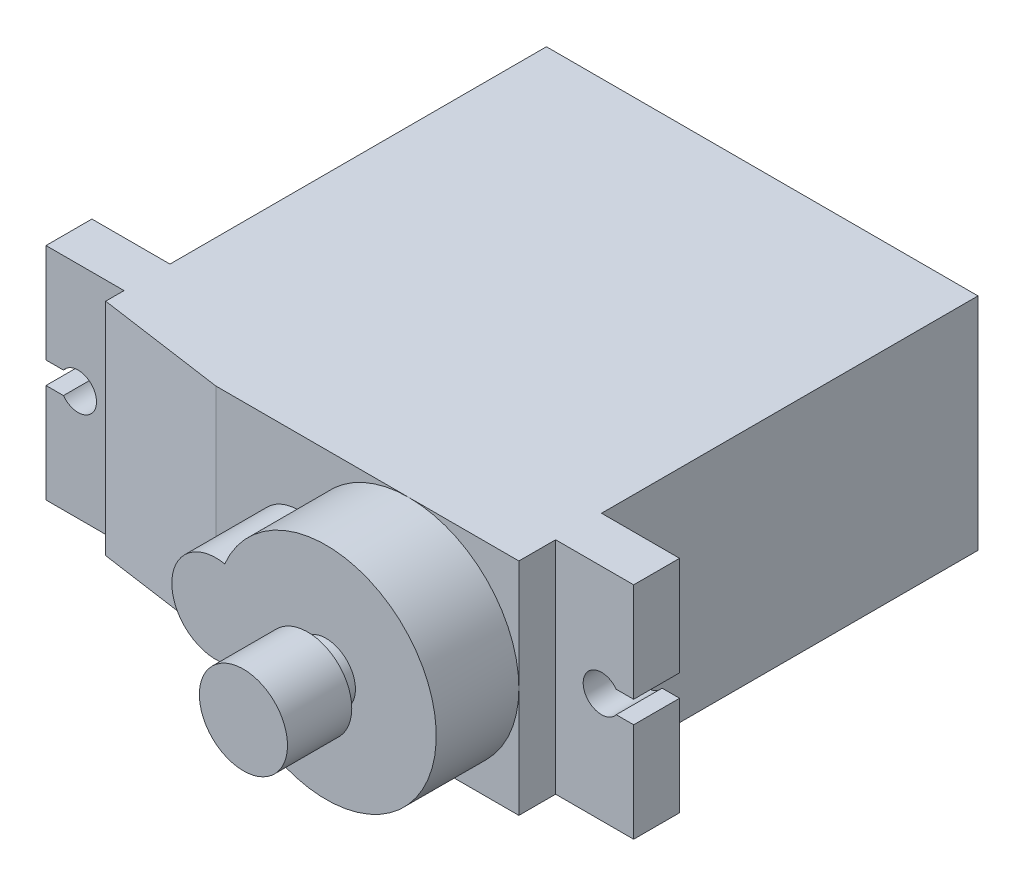
ISO-10303-21;
HEADER;
FILE_DESCRIPTION(('STEP AP214'),'2;1');
FILE_NAME('part.step','',(''),(''),'','','');
FILE_SCHEMA(('AUTOMOTIVE_DESIGN { 1 0 10303 214 1 1 1 1 }'));
ENDSEC;
DATA;
#1=APPLICATION_CONTEXT('core data for automotive mechanical design processes');
#2=APPLICATION_PROTOCOL_DEFINITION('international standard','automotive_design',2000,#1);
#3=PRODUCT_CONTEXT('',#1,'mechanical');
#4=PRODUCT('Part','Part','',(#3));
#5=PRODUCT_RELATED_PRODUCT_CATEGORY('part','',(#4));
#6=PRODUCT_DEFINITION_FORMATION('','',#4);
#7=PRODUCT_DEFINITION_CONTEXT('part definition',#1,'design');
#8=PRODUCT_DEFINITION('design','',#6,#7);
#9=PRODUCT_DEFINITION_SHAPE('','',#8);
#10=(LENGTH_UNIT() NAMED_UNIT(*) SI_UNIT(.MILLI.,.METRE.));
#11=(NAMED_UNIT(*) PLANE_ANGLE_UNIT() SI_UNIT($,.RADIAN.));
#12=(NAMED_UNIT(*) SI_UNIT($,.STERADIAN.) SOLID_ANGLE_UNIT());
#13=UNCERTAINTY_MEASURE_WITH_UNIT(LENGTH_MEASURE(1.E-05),#10,'distance_accuracy_value','');
#14=(GEOMETRIC_REPRESENTATION_CONTEXT(3) GLOBAL_UNCERTAINTY_ASSIGNED_CONTEXT((#13)) GLOBAL_UNIT_ASSIGNED_CONTEXT((#10,
#11,#12)) REPRESENTATION_CONTEXT('',''));
#15=CARTESIAN_POINT('',(0.,0.,0.));
#16=DIRECTION('',(0.,0.,1.));
#17=DIRECTION('',(1.,0.,0.));
#18=AXIS2_PLACEMENT_3D('',#15,#16,#17);
#19=CARTESIAN_POINT('',(0.,0.,6.5));
#20=DIRECTION('',(0.,0.,-1.));
#21=DIRECTION('',(-1.,0.,0.));
#22=AXIS2_PLACEMENT_3D('',#19,#20,#21);
#23=CYLINDRICAL_SURFACE('',#22,6.);
#24=DIRECTION('',(0.,0.,-1.));
#25=VECTOR('',#24,1.);
#26=CARTESIAN_POINT('',(-5.52,2.35151015307185,6.5));
#27=LINE('',#26,#25);
#28=CARTESIAN_POINT('',(-5.52,2.35151015307185,6.5));
#29=VERTEX_POINT('',#28);
#30=CARTESIAN_POINT('',(-5.52,2.35151015307185,2.));
#31=VERTEX_POINT('',#30);
#32=EDGE_CURVE('E200',#29,#31,#27,.T.);
#33=ORIENTED_EDGE('',*,*,#32,.F.);
#34=CARTESIAN_POINT('',(0.,0.,6.5));
#35=DIRECTION('',(0.,0.,1.));
#36=DIRECTION('',(1.,0.,0.));
#37=AXIS2_PLACEMENT_3D('',#34,#35,#36);
#38=CIRCLE('',#37,6.);
#39=CARTESIAN_POINT('',(-5.52,-2.35151015307185,6.5));
#40=VERTEX_POINT('',#39);
#41=EDGE_CURVE('E211',#40,#29,#38,.T.);
#42=ORIENTED_EDGE('',*,*,#41,.F.);
#43=DIRECTION('',(0.,0.,-1.));
#44=VECTOR('',#43,1.);
#45=CARTESIAN_POINT('',(-5.52,-2.35151015307185,6.5));
#46=LINE('',#45,#44);
#47=CARTESIAN_POINT('',(-5.52,-2.35151015307185,2.));
#48=VERTEX_POINT('',#47);
#49=EDGE_CURVE('E203',#40,#48,#46,.T.);
#50=ORIENTED_EDGE('',*,*,#49,.T.);
#51=CARTESIAN_POINT('',(0.,0.,2.));
#52=DIRECTION('',(0.,0.,1.));
#53=DIRECTION('',(1.,0.,0.));
#54=AXIS2_PLACEMENT_3D('',#51,#52,#53);
#55=CIRCLE('',#54,6.);
#56=CARTESIAN_POINT('',(0.,-6.,2.));
#57=VERTEX_POINT('',#56);
#58=EDGE_CURVE('E221',#48,#57,#55,.T.);
#59=ORIENTED_EDGE('',*,*,#58,.T.);
#60=CARTESIAN_POINT('',(6.,0.,2.));
#61=VERTEX_POINT('',#60);
#62=EDGE_CURVE('E217',#57,#61,#55,.T.);
#63=ORIENTED_EDGE('',*,*,#62,.T.);
#64=CARTESIAN_POINT('',(0.,6.,2.));
#65=VERTEX_POINT('',#64);
#66=EDGE_CURVE('E236',#61,#65,#55,.T.);
#67=ORIENTED_EDGE('',*,*,#66,.T.);
#68=EDGE_CURVE('E213',#65,#31,#55,.T.);
#69=ORIENTED_EDGE('',*,*,#68,.T.);
#70=EDGE_LOOP('',(#33,#42,#50,#59,#63,#67,#69));
#71=FACE_BOUND('',#70,.T.);
#72=ADVANCED_FACE('F36',(#71),#23,.T.);
#73=CARTESIAN_POINT('',(-20.,0.,-2.5));
#74=DIRECTION('',(0.,0.,1.));
#75=DIRECTION('',(1.,0.,0.));
#76=AXIS2_PLACEMENT_3D('',#73,#74,#75);
#77=PLANE('',#76);
#78=DIRECTION('',(0.,-1.,0.));
#79=VECTOR('',#78,1.);
#80=CARTESIAN_POINT('',(6.,6.,-2.5));
#81=LINE('',#80,#79);
#82=CARTESIAN_POINT('',(6.,6.,-2.5));
#83=VERTEX_POINT('',#82);
#84=CARTESIAN_POINT('',(6.,-6.,-2.5));
#85=VERTEX_POINT('',#84);
#86=EDGE_CURVE('E250',#83,#85,#81,.T.);
#87=ORIENTED_EDGE('',*,*,#86,.F.);
#88=DIRECTION('',(-1.,0.,0.));
#89=VECTOR('',#88,1.);
#90=CARTESIAN_POINT('',(10.25,6.,-2.5));
#91=LINE('',#90,#89);
#92=CARTESIAN_POINT('',(10.25,6.,-2.5));
#93=VERTEX_POINT('',#92);
#94=EDGE_CURVE('E309',#93,#83,#91,.T.);
#95=ORIENTED_EDGE('',*,*,#94,.F.);
#96=DIRECTION('',(0.,1.,0.));
#97=VECTOR('',#96,1.);
#98=CARTESIAN_POINT('',(10.25,6.,-2.5));
#99=LINE('',#98,#97);
#100=CARTESIAN_POINT('',(10.25,0.600000000000015,-2.5));
#101=VERTEX_POINT('',#100);
#102=EDGE_CURVE('E305',#101,#93,#99,.T.);
#103=ORIENTED_EDGE('',*,*,#102,.F.);
#104=DIRECTION('',(1.,0.,0.));
#105=VECTOR('',#104,1.);
#106=CARTESIAN_POINT('',(10.25,0.600000000000015,-2.5));
#107=LINE('',#106,#105);
#108=CARTESIAN_POINT('',(9.3,0.6,-2.5));
#109=VERTEX_POINT('',#108);
#110=EDGE_CURVE('E302',#109,#101,#107,.T.);
#111=ORIENTED_EDGE('',*,*,#110,.F.);
#112=CARTESIAN_POINT('',(8.5,0.,-2.5));
#113=DIRECTION('',(0.,0.,-1.));
#114=DIRECTION('',(-1.,0.,0.));
#115=AXIS2_PLACEMENT_3D('',#112,#113,#114);
#116=CIRCLE('',#115,1.);
#117=CARTESIAN_POINT('',(9.3,-0.600000000000002,-2.5));
#118=VERTEX_POINT('',#117);
#119=EDGE_CURVE('E299',#118,#109,#116,.T.);
#120=ORIENTED_EDGE('',*,*,#119,.F.);
#121=DIRECTION('',(-1.,0.,0.));
#122=VECTOR('',#121,1.);
#123=CARTESIAN_POINT('',(10.25,-0.600000000000019,-2.5));
#124=LINE('',#123,#122);
#125=CARTESIAN_POINT('',(10.25,-0.600000000000019,-2.5));
#126=VERTEX_POINT('',#125);
#127=EDGE_CURVE('E296',#126,#118,#124,.T.);
#128=ORIENTED_EDGE('',*,*,#127,.F.);
#129=DIRECTION('',(0.,1.,0.));
#130=VECTOR('',#129,1.);
#131=CARTESIAN_POINT('',(10.25,-0.600000000000019,-2.5));
#132=LINE('',#131,#130);
#133=CARTESIAN_POINT('',(10.25,-6.,-2.5));
#134=VERTEX_POINT('',#133);
#135=EDGE_CURVE('E293',#134,#126,#132,.T.);
#136=ORIENTED_EDGE('',*,*,#135,.F.);
#137=DIRECTION('',(1.,0.,0.));
#138=VECTOR('',#137,1.);
#139=CARTESIAN_POINT('',(-21.75,-6.,-2.5));
#140=LINE('',#139,#138);
#141=EDGE_CURVE('E289',#85,#134,#140,.T.);
#142=ORIENTED_EDGE('',*,*,#141,.F.);
#143=EDGE_LOOP('',(#87,#95,#103,#111,#120,#128,#136,#142));
#144=FACE_BOUND('',#143,.T.);
#145=ADVANCED_FACE('F498',(#144),#77,.F.);
#146=DIRECTION('',(0.,1.,0.));
#147=VECTOR('',#146,1.);
#148=CARTESIAN_POINT('',(-17.5,-6.,-2.5));
#149=LINE('',#148,#147);
#150=CARTESIAN_POINT('',(-17.5,-6.,-2.5));
#151=VERTEX_POINT('',#150);
#152=CARTESIAN_POINT('',(-17.5,6.,-2.5));
#153=VERTEX_POINT('',#152);
#154=EDGE_CURVE('E214',#151,#153,#149,.T.);
#155=ORIENTED_EDGE('',*,*,#154,.F.);
#156=CARTESIAN_POINT('',(-21.75,-6.,-2.5));
#157=VERTEX_POINT('',#156);
#158=EDGE_CURVE('E290',#157,#151,#140,.T.);
#159=ORIENTED_EDGE('',*,*,#158,.F.);
#160=DIRECTION('',(0.,-1.,0.));
#161=VECTOR('',#160,1.);
#162=CARTESIAN_POINT('',(-21.75,-0.600000000000015,-2.5));
#163=LINE('',#162,#161);
#164=CARTESIAN_POINT('',(-21.75,-0.600000000000015,-2.5));
#165=VERTEX_POINT('',#164);
#166=EDGE_CURVE('E286',#165,#157,#163,.T.);
#167=ORIENTED_EDGE('',*,*,#166,.F.);
#168=DIRECTION('',(-1.,0.,0.));
#169=VECTOR('',#168,1.);
#170=CARTESIAN_POINT('',(-21.75,-0.600000000000015,-2.5));
#171=LINE('',#170,#169);
#172=CARTESIAN_POINT('',(-20.8,-0.600000000000015,-2.5));
#173=VERTEX_POINT('',#172);
#174=EDGE_CURVE('E283',#173,#165,#171,.T.);
#175=ORIENTED_EDGE('',*,*,#174,.F.);
#176=CARTESIAN_POINT('',(-20.,0.,-2.5));
#177=DIRECTION('',(0.,0.,-1.));
#178=DIRECTION('',(1.,0.,0.));
#179=AXIS2_PLACEMENT_3D('',#176,#177,#178);
#180=CIRCLE('',#179,1.);
#181=CARTESIAN_POINT('',(-20.8,0.60000000000001,-2.5));
#182=VERTEX_POINT('',#181);
#183=EDGE_CURVE('E280',#182,#173,#180,.T.);
#184=ORIENTED_EDGE('',*,*,#183,.F.);
#185=DIRECTION('',(1.,0.,0.));
#186=VECTOR('',#185,1.);
#187=CARTESIAN_POINT('',(-21.75,0.600000000000011,-2.5));
#188=LINE('',#187,#186);
#189=CARTESIAN_POINT('',(-21.75,0.600000000000011,-2.5));
#190=VERTEX_POINT('',#189);
#191=EDGE_CURVE('E276',#190,#182,#188,.T.);
#192=ORIENTED_EDGE('',*,*,#191,.F.);
#193=DIRECTION('',(0.,-1.,0.));
#194=VECTOR('',#193,1.);
#195=CARTESIAN_POINT('',(-21.75,6.,-2.5));
#196=LINE('',#195,#194);
#197=CARTESIAN_POINT('',(-21.75,6.,-2.5));
#198=VERTEX_POINT('',#197);
#199=EDGE_CURVE('E273',#198,#190,#196,.T.);
#200=ORIENTED_EDGE('',*,*,#199,.F.);
#201=EDGE_CURVE('E308',#153,#198,#91,.T.);
#202=ORIENTED_EDGE('',*,*,#201,.F.);
#203=EDGE_LOOP('',(#155,#159,#167,#175,#184,#192,#200,#202));
#204=FACE_BOUND('',#203,.T.);
#205=ADVANCED_FACE('F449',(#204),#77,.F.);
#206=CARTESIAN_POINT('',(0.,0.,6.5));
#207=DIRECTION('',(0.,0.,1.));
#208=DIRECTION('',(1.,0.,0.));
#209=AXIS2_PLACEMENT_3D('',#206,#207,#208);
#210=PLANE('',#209);
#211=CARTESIAN_POINT('',(0.,0.,6.5));
#212=DIRECTION('',(0.,0.,1.));
#213=DIRECTION('',(1.,0.,0.));
#214=AXIS2_PLACEMENT_3D('',#211,#212,#213);
#215=CIRCLE('',#214,1.6);
#216=CARTESIAN_POINT('',(1.6,0.,6.5));
#217=VERTEX_POINT('',#216);
#218=EDGE_CURVE('E231',#217,#217,#215,.T.);
#219=ORIENTED_EDGE('',*,*,#218,.F.);
#220=EDGE_LOOP('',(#219));
#221=FACE_BOUND('',#220,.T.);
#222=ORIENTED_EDGE('',*,*,#41,.T.);
#223=CARTESIAN_POINT('',(-6.,0.,6.5));
#224=DIRECTION('',(0.,0.,1.));
#225=DIRECTION('',(1.,0.,0.));
#226=AXIS2_PLACEMENT_3D('',#223,#224,#225);
#227=CIRCLE('',#226,2.4);
#228=EDGE_CURVE('E197',#29,#40,#227,.T.);
#229=ORIENTED_EDGE('',*,*,#228,.T.);
#230=EDGE_LOOP('',(#222,#229));
#231=FACE_BOUND('',#230,.T.);
#232=ADVANCED_FACE('F216',(#221,#231),#210,.T.);
#233=CARTESIAN_POINT('',(0.,0.,2.));
#234=DIRECTION('',(0.,0.,1.));
#235=DIRECTION('',(1.,0.,0.));
#236=AXIS2_PLACEMENT_3D('',#233,#234,#235);
#237=PLANE('',#236);
#238=ORIENTED_EDGE('',*,*,#66,.F.);
#239=DIRECTION('',(0.,1.,0.));
#240=VECTOR('',#239,1.);
#241=CARTESIAN_POINT('',(6.,-6.,2.));
#242=LINE('',#241,#240);
#243=CARTESIAN_POINT('',(6.,6.,2.));
#244=VERTEX_POINT('',#243);
#245=EDGE_CURVE('E376',#61,#244,#242,.T.);
#246=ORIENTED_EDGE('',*,*,#245,.T.);
#247=DIRECTION('',(-1.,0.,0.));
#248=VECTOR('',#247,1.);
#249=CARTESIAN_POINT('',(6.,6.,2.));
#250=LINE('',#249,#248);
#251=EDGE_CURVE('E381',#244,#65,#250,.T.);
#252=ORIENTED_EDGE('',*,*,#251,.T.);
#253=EDGE_LOOP('',(#238,#246,#252));
#254=FACE_BOUND('',#253,.T.);
#255=ADVANCED_FACE('F486',(#254),#237,.T.);
#256=CARTESIAN_POINT('',(-10.4999999999998,6.,2.));
#257=VERTEX_POINT('',#256);
#258=EDGE_CURVE('E380',#65,#257,#250,.T.);
#259=ORIENTED_EDGE('',*,*,#258,.T.);
#260=DIRECTION('',(0.,-1.,0.));
#261=VECTOR('',#260,1.);
#262=CARTESIAN_POINT('',(-10.4999999999998,-6.,2.));
#263=LINE('',#262,#261);
#264=CARTESIAN_POINT('',(-10.4999999999998,-6.,2.));
#265=VERTEX_POINT('',#264);
#266=EDGE_CURVE('E228',#257,#265,#263,.T.);
#267=ORIENTED_EDGE('',*,*,#266,.T.);
#268=DIRECTION('',(1.,0.,0.));
#269=VECTOR('',#268,1.);
#270=CARTESIAN_POINT('',(6.,-6.,2.));
#271=LINE('',#270,#269);
#272=EDGE_CURVE('E374',#265,#57,#271,.T.);
#273=ORIENTED_EDGE('',*,*,#272,.T.);
#274=ORIENTED_EDGE('',*,*,#58,.F.);
#275=CARTESIAN_POINT('',(-6.,0.,2.));
#276=DIRECTION('',(0.,0.,1.));
#277=DIRECTION('',(1.,0.,0.));
#278=AXIS2_PLACEMENT_3D('',#275,#276,#277);
#279=CIRCLE('',#278,2.4);
#280=EDGE_CURVE('E207',#31,#48,#279,.T.);
#281=ORIENTED_EDGE('',*,*,#280,.F.);
#282=ORIENTED_EDGE('',*,*,#68,.F.);
#283=EDGE_LOOP('',(#259,#267,#273,#274,#281,#282));
#284=FACE_BOUND('',#283,.T.);
#285=ADVANCED_FACE('F478',(#284),#237,.T.);
#286=CARTESIAN_POINT('',(6.,-6.,2.));
#287=DIRECTION('',(0.,1.,0.));
#288=DIRECTION('',(-1.,0.,0.));
#289=AXIS2_PLACEMENT_3D('',#286,#287,#288);
#290=PLANE('',#289);
#291=ORIENTED_EDGE('',*,*,#272,.F.);
#292=DIRECTION('',(-0.989949493661167,0.,-0.141421356237306));
#293=VECTOR('',#292,1.);
#294=CARTESIAN_POINT('',(-10.4999999999998,-6.,2.));
#295=LINE('',#294,#293);
#296=CARTESIAN_POINT('',(-17.5,-6.,0.999999999999999));
#297=VERTEX_POINT('',#296);
#298=EDGE_CURVE('E58',#265,#297,#295,.T.);
#299=ORIENTED_EDGE('',*,*,#298,.T.);
#300=DIRECTION('',(0.,0.,-1.));
#301=VECTOR('',#300,1.);
#302=CARTESIAN_POINT('',(-17.5,-6.,2.));
#303=LINE('',#302,#301);
#304=CARTESIAN_POINT('',(-17.5,-6.,0.));
#305=VERTEX_POINT('',#304);
#306=EDGE_CURVE('E384',#297,#305,#303,.T.);
#307=ORIENTED_EDGE('',*,*,#306,.T.);
#308=DIRECTION('',(1.,0.,0.));
#309=VECTOR('',#308,1.);
#310=CARTESIAN_POINT('',(-21.75,-6.,0.));
#311=LINE('',#310,#309);
#312=CARTESIAN_POINT('',(-21.75,-6.,0.));
#313=VERTEX_POINT('',#312);
#314=EDGE_CURVE('E328',#313,#305,#311,.T.);
#315=ORIENTED_EDGE('',*,*,#314,.F.);
#316=DIRECTION('',(0.,0.,1.));
#317=VECTOR('',#316,1.);
#318=CARTESIAN_POINT('',(-21.75,-6.,-2.5));
#319=LINE('',#318,#317);
#320=EDGE_CURVE('E365',#157,#313,#319,.T.);
#321=ORIENTED_EDGE('',*,*,#320,.F.);
#322=ORIENTED_EDGE('',*,*,#158,.T.);
#323=DIRECTION('',(0.,0.,1.));
#324=VECTOR('',#323,1.);
#325=CARTESIAN_POINT('',(-17.5,-6.,-23.));
#326=LINE('',#325,#324);
#327=CARTESIAN_POINT('',(-17.5,-6.,-23.));
#328=VERTEX_POINT('',#327);
#329=EDGE_CURVE('E269',#328,#151,#326,.T.);
#330=ORIENTED_EDGE('',*,*,#329,.F.);
#331=DIRECTION('',(-1.,0.,0.));
#332=VECTOR('',#331,1.);
#333=CARTESIAN_POINT('',(6.,-6.,-23.));
#334=LINE('',#333,#332);
#335=CARTESIAN_POINT('',(6.,-6.,-23.));
#336=VERTEX_POINT('',#335);
#337=EDGE_CURVE('E246',#336,#328,#334,.T.);
#338=ORIENTED_EDGE('',*,*,#337,.F.);
#339=DIRECTION('',(0.,0.,1.));
#340=VECTOR('',#339,1.);
#341=CARTESIAN_POINT('',(6.,-6.,-23.));
#342=LINE('',#341,#340);
#343=EDGE_CURVE('E256',#336,#85,#342,.T.);
#344=ORIENTED_EDGE('',*,*,#343,.T.);
#345=ORIENTED_EDGE('',*,*,#141,.T.);
#346=DIRECTION('',(0.,0.,1.));
#347=VECTOR('',#346,1.);
#348=CARTESIAN_POINT('',(10.25,-6.,-2.5));
#349=LINE('',#348,#347);
#350=CARTESIAN_POINT('',(10.25,-6.,0.));
#351=VERTEX_POINT('',#350);
#352=EDGE_CURVE('E362',#134,#351,#349,.T.);
#353=ORIENTED_EDGE('',*,*,#352,.T.);
#354=CARTESIAN_POINT('',(6.,-6.,0.));
#355=VERTEX_POINT('',#354);
#356=EDGE_CURVE('E327',#355,#351,#311,.T.);
#357=ORIENTED_EDGE('',*,*,#356,.F.);
#358=DIRECTION('',(0.,0.,-1.));
#359=VECTOR('',#358,1.);
#360=CARTESIAN_POINT('',(6.,-6.,2.));
#361=LINE('',#360,#359);
#362=CARTESIAN_POINT('',(6.,-6.,2.));
#363=VERTEX_POINT('',#362);
#364=EDGE_CURVE('E218',#363,#355,#361,.T.);
#365=ORIENTED_EDGE('',*,*,#364,.F.);
#366=EDGE_CURVE('E377',#57,#363,#271,.T.);
#367=ORIENTED_EDGE('',*,*,#366,.F.);
#368=EDGE_LOOP('',(#291,#299,#307,#315,#321,#322,#330,#338,#344,#345,#353,#357,#365,#367));
#369=FACE_BOUND('',#368,.T.);
#370=ADVANCED_FACE('F408',(#369),#290,.F.);
#371=CARTESIAN_POINT('',(6.,-6.,2.));
#372=DIRECTION('',(-1.,0.,0.));
#373=DIRECTION('',(0.,0.,1.));
#374=AXIS2_PLACEMENT_3D('',#371,#372,#373);
#375=PLANE('',#374);
#376=ORIENTED_EDGE('',*,*,#245,.F.);
#377=EDGE_CURVE('E378',#363,#61,#242,.T.);
#378=ORIENTED_EDGE('',*,*,#377,.F.);
#379=ORIENTED_EDGE('',*,*,#364,.T.);
#380=DIRECTION('',(0.,1.,0.));
#381=VECTOR('',#380,1.);
#382=CARTESIAN_POINT('',(6.,-6.,0.));
#383=LINE('',#382,#381);
#384=CARTESIAN_POINT('',(6.,6.,0.));
#385=VERTEX_POINT('',#384);
#386=EDGE_CURVE('E351',#355,#385,#383,.T.);
#387=ORIENTED_EDGE('',*,*,#386,.T.);
#388=DIRECTION('',(0.,0.,-1.));
#389=VECTOR('',#388,1.);
#390=CARTESIAN_POINT('',(6.,6.,2.));
#391=LINE('',#390,#389);
#392=EDGE_CURVE('E224',#244,#385,#391,.T.);
#393=ORIENTED_EDGE('',*,*,#392,.F.);
#394=EDGE_LOOP('',(#376,#378,#379,#387,#393));
#395=FACE_BOUND('',#394,.T.);
#396=ADVANCED_FACE('F401',(#395),#375,.F.);
#397=CARTESIAN_POINT('',(6.,6.,2.));
#398=DIRECTION('',(0.,-1.,0.));
#399=DIRECTION('',(1.,0.,0.));
#400=AXIS2_PLACEMENT_3D('',#397,#398,#399);
#401=PLANE('',#400);
#402=DIRECTION('',(0.,0.,-1.));
#403=VECTOR('',#402,1.);
#404=CARTESIAN_POINT('',(-17.5,6.,2.));
#405=LINE('',#404,#403);
#406=CARTESIAN_POINT('',(-17.5,6.,0.999999999999999));
#407=VERTEX_POINT('',#406);
#408=CARTESIAN_POINT('',(-17.5,6.,0.));
#409=VERTEX_POINT('',#408);
#410=EDGE_CURVE('E391',#407,#409,#405,.T.);
#411=ORIENTED_EDGE('',*,*,#410,.F.);
#412=DIRECTION('',(0.989949493661167,0.,0.141421356237306));
#413=VECTOR('',#412,1.);
#414=CARTESIAN_POINT('',(-10.4999999999998,6.,2.));
#415=LINE('',#414,#413);
#416=EDGE_CURVE('E11',#407,#257,#415,.T.);
#417=ORIENTED_EDGE('',*,*,#416,.T.);
#418=ORIENTED_EDGE('',*,*,#258,.F.);
#419=ORIENTED_EDGE('',*,*,#251,.F.);
#420=ORIENTED_EDGE('',*,*,#392,.T.);
#421=DIRECTION('',(-1.,0.,0.));
#422=VECTOR('',#421,1.);
#423=CARTESIAN_POINT('',(10.25,6.,0.));
#424=LINE('',#423,#422);
#425=CARTESIAN_POINT('',(10.25,6.,0.));
#426=VERTEX_POINT('',#425);
#427=EDGE_CURVE('E277',#426,#385,#424,.T.);
#428=ORIENTED_EDGE('',*,*,#427,.F.);
#429=DIRECTION('',(0.,0.,1.));
#430=VECTOR('',#429,1.);
#431=CARTESIAN_POINT('',(10.25,6.,-2.5));
#432=LINE('',#431,#430);
#433=EDGE_CURVE('E352',#93,#426,#432,.T.);
#434=ORIENTED_EDGE('',*,*,#433,.F.);
#435=ORIENTED_EDGE('',*,*,#94,.T.);
#436=DIRECTION('',(0.,0.,1.));
#437=VECTOR('',#436,1.);
#438=CARTESIAN_POINT('',(6.,6.,-23.));
#439=LINE('',#438,#437);
#440=CARTESIAN_POINT('',(6.,6.,-23.));
#441=VERTEX_POINT('',#440);
#442=EDGE_CURVE('E263',#441,#83,#439,.T.);
#443=ORIENTED_EDGE('',*,*,#442,.F.);
#444=DIRECTION('',(1.,0.,0.));
#445=VECTOR('',#444,1.);
#446=CARTESIAN_POINT('',(-17.5,6.,-23.));
#447=LINE('',#446,#445);
#448=CARTESIAN_POINT('',(-17.5,6.,-23.));
#449=VERTEX_POINT('',#448);
#450=EDGE_CURVE('E252',#449,#441,#447,.T.);
#451=ORIENTED_EDGE('',*,*,#450,.F.);
#452=DIRECTION('',(0.,0.,1.));
#453=VECTOR('',#452,1.);
#454=CARTESIAN_POINT('',(-17.5,6.,-23.));
#455=LINE('',#454,#453);
#456=EDGE_CURVE('E266',#449,#153,#455,.T.);
#457=ORIENTED_EDGE('',*,*,#456,.T.);
#458=ORIENTED_EDGE('',*,*,#201,.T.);
#459=DIRECTION('',(0.,0.,1.));
#460=VECTOR('',#459,1.);
#461=CARTESIAN_POINT('',(-21.75,6.,-2.5));
#462=LINE('',#461,#460);
#463=CARTESIAN_POINT('',(-21.75,6.,0.));
#464=VERTEX_POINT('',#463);
#465=EDGE_CURVE('E348',#198,#464,#462,.T.);
#466=ORIENTED_EDGE('',*,*,#465,.T.);
#467=EDGE_CURVE('E346',#409,#464,#424,.T.);
#468=ORIENTED_EDGE('',*,*,#467,.F.);
#469=EDGE_LOOP('',(#411,#417,#418,#419,#420,#428,#434,#435,#443,#451,#457,#458,#466,#468));
#470=FACE_BOUND('',#469,.T.);
#471=ADVANCED_FACE('F397',(#470),#401,.F.);
#472=CARTESIAN_POINT('',(-17.5,6.,2.));
#473=DIRECTION('',(1.,0.,0.));
#474=DIRECTION('',(0.,0.,-1.));
#475=AXIS2_PLACEMENT_3D('',#472,#473,#474);
#476=PLANE('',#475);
#477=ORIENTED_EDGE('',*,*,#306,.F.);
#478=DIRECTION('',(0.,1.,0.));
#479=VECTOR('',#478,1.);
#480=CARTESIAN_POINT('',(-17.5,6.,0.999999999999999));
#481=LINE('',#480,#479);
#482=EDGE_CURVE('E44',#297,#407,#481,.T.);
#483=ORIENTED_EDGE('',*,*,#482,.T.);
#484=ORIENTED_EDGE('',*,*,#410,.T.);
#485=DIRECTION('',(0.,-1.,0.));
#486=VECTOR('',#485,1.);
#487=CARTESIAN_POINT('',(-17.5,6.,0.));
#488=LINE('',#487,#486);
#489=EDGE_CURVE('E387',#409,#305,#488,.T.);
#490=ORIENTED_EDGE('',*,*,#489,.T.);
#491=EDGE_LOOP('',(#477,#483,#484,#490));
#492=FACE_BOUND('',#491,.T.);
#493=ADVANCED_FACE('F476',(#492),#476,.F.);
#494=ORIENTED_EDGE('',*,*,#62,.F.);
#495=ORIENTED_EDGE('',*,*,#366,.T.);
#496=ORIENTED_EDGE('',*,*,#377,.T.);
#497=EDGE_LOOP('',(#494,#495,#496));
#498=FACE_BOUND('',#497,.T.);
#499=ADVANCED_FACE('F483',(#498),#237,.T.);
#500=CARTESIAN_POINT('',(-20.,0.,0.));
#501=DIRECTION('',(0.,0.,1.));
#502=DIRECTION('',(1.,0.,0.));
#503=AXIS2_PLACEMENT_3D('',#500,#501,#502);
#504=PLANE('',#503);
#505=ORIENTED_EDGE('',*,*,#386,.F.);
#506=ORIENTED_EDGE('',*,*,#356,.T.);
#507=DIRECTION('',(0.,1.,0.));
#508=VECTOR('',#507,1.);
#509=CARTESIAN_POINT('',(10.25,-0.600000000000019,0.));
#510=LINE('',#509,#508);
#511=CARTESIAN_POINT('',(10.25,-0.600000000000019,0.));
#512=VERTEX_POINT('',#511);
#513=EDGE_CURVE('E331',#351,#512,#510,.T.);
#514=ORIENTED_EDGE('',*,*,#513,.T.);
#515=DIRECTION('',(-1.,0.,0.));
#516=VECTOR('',#515,1.);
#517=CARTESIAN_POINT('',(10.25,-0.600000000000019,0.));
#518=LINE('',#517,#516);
#519=CARTESIAN_POINT('',(9.3,-0.600000000000002,0.));
#520=VERTEX_POINT('',#519);
#521=EDGE_CURVE('E334',#512,#520,#518,.T.);
#522=ORIENTED_EDGE('',*,*,#521,.T.);
#523=CARTESIAN_POINT('',(8.5,0.,0.));
#524=DIRECTION('',(0.,0.,-1.));
#525=DIRECTION('',(-1.,0.,0.));
#526=AXIS2_PLACEMENT_3D('',#523,#524,#525);
#527=CIRCLE('',#526,1.);
#528=CARTESIAN_POINT('',(9.3,0.6,0.));
#529=VERTEX_POINT('',#528);
#530=EDGE_CURVE('E337',#520,#529,#527,.T.);
#531=ORIENTED_EDGE('',*,*,#530,.T.);
#532=DIRECTION('',(1.,0.,0.));
#533=VECTOR('',#532,1.);
#534=CARTESIAN_POINT('',(10.25,0.600000000000015,0.));
#535=LINE('',#534,#533);
#536=CARTESIAN_POINT('',(10.25,0.600000000000015,0.));
#537=VERTEX_POINT('',#536);
#538=EDGE_CURVE('E340',#529,#537,#535,.T.);
#539=ORIENTED_EDGE('',*,*,#538,.T.);
#540=DIRECTION('',(0.,1.,0.));
#541=VECTOR('',#540,1.);
#542=CARTESIAN_POINT('',(10.25,6.,0.));
#543=LINE('',#542,#541);
#544=EDGE_CURVE('E343',#537,#426,#543,.T.);
#545=ORIENTED_EDGE('',*,*,#544,.T.);
#546=ORIENTED_EDGE('',*,*,#427,.T.);
#547=EDGE_LOOP('',(#505,#506,#514,#522,#531,#539,#545,#546));
#548=FACE_BOUND('',#547,.T.);
#549=ADVANCED_FACE('F407',(#548),#504,.T.);
#550=ORIENTED_EDGE('',*,*,#489,.F.);
#551=ORIENTED_EDGE('',*,*,#467,.T.);
#552=DIRECTION('',(0.,-1.,0.));
#553=VECTOR('',#552,1.);
#554=CARTESIAN_POINT('',(-21.75,6.,0.));
#555=LINE('',#554,#553);
#556=CARTESIAN_POINT('',(-21.75,0.600000000000011,0.));
#557=VERTEX_POINT('',#556);
#558=EDGE_CURVE('E272',#464,#557,#555,.T.);
#559=ORIENTED_EDGE('',*,*,#558,.T.);
#560=DIRECTION('',(1.,0.,0.));
#561=VECTOR('',#560,1.);
#562=CARTESIAN_POINT('',(-21.75,0.600000000000011,0.));
#563=LINE('',#562,#561);
#564=CARTESIAN_POINT('',(-20.8,0.60000000000001,0.));
#565=VERTEX_POINT('',#564);
#566=EDGE_CURVE('E315',#557,#565,#563,.T.);
#567=ORIENTED_EDGE('',*,*,#566,.T.);
#568=CARTESIAN_POINT('',(-20.,0.,0.));
#569=DIRECTION('',(0.,0.,-1.));
#570=DIRECTION('',(1.,0.,0.));
#571=AXIS2_PLACEMENT_3D('',#568,#569,#570);
#572=CIRCLE('',#571,1.);
#573=CARTESIAN_POINT('',(-20.8,-0.600000000000015,0.));
#574=VERTEX_POINT('',#573);
#575=EDGE_CURVE('E318',#565,#574,#572,.T.);
#576=ORIENTED_EDGE('',*,*,#575,.T.);
#577=DIRECTION('',(-1.,0.,0.));
#578=VECTOR('',#577,1.);
#579=CARTESIAN_POINT('',(-21.75,-0.600000000000015,0.));
#580=LINE('',#579,#578);
#581=CARTESIAN_POINT('',(-21.75,-0.600000000000015,0.));
#582=VERTEX_POINT('',#581);
#583=EDGE_CURVE('E321',#574,#582,#580,.T.);
#584=ORIENTED_EDGE('',*,*,#583,.T.);
#585=DIRECTION('',(0.,-1.,0.));
#586=VECTOR('',#585,1.);
#587=CARTESIAN_POINT('',(-21.75,-0.600000000000015,0.));
#588=LINE('',#587,#586);
#589=EDGE_CURVE('E324',#582,#313,#588,.T.);
#590=ORIENTED_EDGE('',*,*,#589,.T.);
#591=ORIENTED_EDGE('',*,*,#314,.T.);
#592=EDGE_LOOP('',(#550,#551,#559,#567,#576,#584,#590,#591));
#593=FACE_BOUND('',#592,.T.);
#594=ADVANCED_FACE('F475',(#593),#504,.T.);
#595=CARTESIAN_POINT('',(-21.75,6.,-2.5));
#596=DIRECTION('',(-1.,0.,0.));
#597=DIRECTION('',(0.,0.,1.));
#598=AXIS2_PLACEMENT_3D('',#595,#596,#597);
#599=PLANE('',#598);
#600=ORIENTED_EDGE('',*,*,#558,.F.);
#601=ORIENTED_EDGE('',*,*,#465,.F.);
#602=ORIENTED_EDGE('',*,*,#199,.T.);
#603=DIRECTION('',(0.,0.,1.));
#604=VECTOR('',#603,1.);
#605=CARTESIAN_POINT('',(-21.75,0.600000000000011,-2.5));
#606=LINE('',#605,#604);
#607=EDGE_CURVE('E312',#190,#557,#606,.T.);
#608=ORIENTED_EDGE('',*,*,#607,.T.);
#609=EDGE_LOOP('',(#600,#601,#602,#608));
#610=FACE_BOUND('',#609,.T.);
#611=ADVANCED_FACE('F470',(#610),#599,.T.);
#612=CARTESIAN_POINT('',(10.25,6.,-2.5));
#613=DIRECTION('',(1.,0.,0.));
#614=DIRECTION('',(0.,0.,-1.));
#615=AXIS2_PLACEMENT_3D('',#612,#613,#614);
#616=PLANE('',#615);
#617=ORIENTED_EDGE('',*,*,#544,.F.);
#618=DIRECTION('',(0.,0.,1.));
#619=VECTOR('',#618,1.);
#620=CARTESIAN_POINT('',(10.25,0.600000000000015,-2.5));
#621=LINE('',#620,#619);
#622=EDGE_CURVE('E354',#101,#537,#621,.T.);
#623=ORIENTED_EDGE('',*,*,#622,.F.);
#624=ORIENTED_EDGE('',*,*,#102,.T.);
#625=ORIENTED_EDGE('',*,*,#433,.T.);
#626=EDGE_LOOP('',(#617,#623,#624,#625));
#627=FACE_BOUND('',#626,.T.);
#628=ADVANCED_FACE('F429',(#627),#616,.T.);
#629=CARTESIAN_POINT('',(10.25,0.600000000000015,-2.5));
#630=DIRECTION('',(0.,-1.,0.));
#631=DIRECTION('',(1.,0.,0.));
#632=AXIS2_PLACEMENT_3D('',#629,#630,#631);
#633=PLANE('',#632);
#634=ORIENTED_EDGE('',*,*,#538,.F.);
#635=DIRECTION('',(0.,0.,1.));
#636=VECTOR('',#635,1.);
#637=CARTESIAN_POINT('',(9.3,0.6,-2.5));
#638=LINE('',#637,#636);
#639=EDGE_CURVE('E356',#109,#529,#638,.T.);
#640=ORIENTED_EDGE('',*,*,#639,.F.);
#641=ORIENTED_EDGE('',*,*,#110,.T.);
#642=ORIENTED_EDGE('',*,*,#622,.T.);
#643=EDGE_LOOP('',(#634,#640,#641,#642));
#644=FACE_BOUND('',#643,.T.);
#645=ADVANCED_FACE('F426',(#644),#633,.T.);
#646=CARTESIAN_POINT('',(8.5,0.,-2.5));
#647=DIRECTION('',(0.,0.,1.));
#648=DIRECTION('',(1.,0.,0.));
#649=AXIS2_PLACEMENT_3D('',#646,#647,#648);
#650=CYLINDRICAL_SURFACE('',#649,1.);
#651=ORIENTED_EDGE('',*,*,#530,.F.);
#652=DIRECTION('',(0.,0.,1.));
#653=VECTOR('',#652,1.);
#654=CARTESIAN_POINT('',(9.3,-0.600000000000002,-2.5));
#655=LINE('',#654,#653);
#656=EDGE_CURVE('E358',#118,#520,#655,.T.);
#657=ORIENTED_EDGE('',*,*,#656,.F.);
#658=ORIENTED_EDGE('',*,*,#119,.T.);
#659=ORIENTED_EDGE('',*,*,#639,.T.);
#660=EDGE_LOOP('',(#651,#657,#658,#659));
#661=FACE_BOUND('',#660,.T.);
#662=ADVANCED_FACE('F422',(#661),#650,.F.);
#663=CARTESIAN_POINT('',(10.25,-0.600000000000019,-2.5));
#664=DIRECTION('',(0.,1.,0.));
#665=DIRECTION('',(-1.,0.,0.));
#666=AXIS2_PLACEMENT_3D('',#663,#664,#665);
#667=PLANE('',#666);
#668=ORIENTED_EDGE('',*,*,#521,.F.);
#669=DIRECTION('',(0.,0.,1.));
#670=VECTOR('',#669,1.);
#671=CARTESIAN_POINT('',(10.25,-0.600000000000019,-2.5));
#672=LINE('',#671,#670);
#673=EDGE_CURVE('E360',#126,#512,#672,.T.);
#674=ORIENTED_EDGE('',*,*,#673,.F.);
#675=ORIENTED_EDGE('',*,*,#127,.T.);
#676=ORIENTED_EDGE('',*,*,#656,.T.);
#677=EDGE_LOOP('',(#668,#674,#675,#676));
#678=FACE_BOUND('',#677,.T.);
#679=ADVANCED_FACE('F418',(#678),#667,.T.);
#680=CARTESIAN_POINT('',(10.25,-0.600000000000019,-2.5));
#681=DIRECTION('',(1.,0.,0.));
#682=DIRECTION('',(0.,0.,-1.));
#683=AXIS2_PLACEMENT_3D('',#680,#681,#682);
#684=PLANE('',#683);
#685=ORIENTED_EDGE('',*,*,#513,.F.);
#686=ORIENTED_EDGE('',*,*,#352,.F.);
#687=ORIENTED_EDGE('',*,*,#135,.T.);
#688=ORIENTED_EDGE('',*,*,#673,.T.);
#689=EDGE_LOOP('',(#685,#686,#687,#688));
#690=FACE_BOUND('',#689,.T.);
#691=ADVANCED_FACE('F414',(#690),#684,.T.);
#692=CARTESIAN_POINT('',(-21.75,-0.600000000000015,-2.5));
#693=DIRECTION('',(-1.,0.,0.));
#694=DIRECTION('',(0.,0.,1.));
#695=AXIS2_PLACEMENT_3D('',#692,#693,#694);
#696=PLANE('',#695);
#697=ORIENTED_EDGE('',*,*,#589,.F.);
#698=DIRECTION('',(0.,0.,1.));
#699=VECTOR('',#698,1.);
#700=CARTESIAN_POINT('',(-21.75,-0.600000000000015,-2.5));
#701=LINE('',#700,#699);
#702=EDGE_CURVE('E367',#165,#582,#701,.T.);
#703=ORIENTED_EDGE('',*,*,#702,.F.);
#704=ORIENTED_EDGE('',*,*,#166,.T.);
#705=ORIENTED_EDGE('',*,*,#320,.T.);
#706=EDGE_LOOP('',(#697,#703,#704,#705));
#707=FACE_BOUND('',#706,.T.);
#708=ADVANCED_FACE('F455',(#707),#696,.T.);
#709=CARTESIAN_POINT('',(-21.75,-0.600000000000015,-2.5));
#710=DIRECTION('',(0.,1.,0.));
#711=DIRECTION('',(-1.,0.,0.));
#712=AXIS2_PLACEMENT_3D('',#709,#710,#711);
#713=PLANE('',#712);
#714=ORIENTED_EDGE('',*,*,#583,.F.);
#715=DIRECTION('',(0.,0.,1.));
#716=VECTOR('',#715,1.);
#717=CARTESIAN_POINT('',(-20.8,-0.600000000000015,-2.5));
#718=LINE('',#717,#716);
#719=EDGE_CURVE('E369',#173,#574,#718,.T.);
#720=ORIENTED_EDGE('',*,*,#719,.F.);
#721=ORIENTED_EDGE('',*,*,#174,.T.);
#722=ORIENTED_EDGE('',*,*,#702,.T.);
#723=EDGE_LOOP('',(#714,#720,#721,#722));
#724=FACE_BOUND('',#723,.T.);
#725=ADVANCED_FACE('F460',(#724),#713,.T.);
#726=CARTESIAN_POINT('',(-20.,0.,-2.5));
#727=DIRECTION('',(0.,0.,1.));
#728=DIRECTION('',(1.,0.,0.));
#729=AXIS2_PLACEMENT_3D('',#726,#727,#728);
#730=CYLINDRICAL_SURFACE('',#729,1.);
#731=ORIENTED_EDGE('',*,*,#575,.F.);
#732=DIRECTION('',(0.,0.,1.));
#733=VECTOR('',#732,1.);
#734=CARTESIAN_POINT('',(-20.8,0.60000000000001,-2.5));
#735=LINE('',#734,#733);
#736=EDGE_CURVE('E371',#182,#565,#735,.T.);
#737=ORIENTED_EDGE('',*,*,#736,.F.);
#738=ORIENTED_EDGE('',*,*,#183,.T.);
#739=ORIENTED_EDGE('',*,*,#719,.T.);
#740=EDGE_LOOP('',(#731,#737,#738,#739));
#741=FACE_BOUND('',#740,.T.);
#742=ADVANCED_FACE('F463',(#741),#730,.F.);
#743=CARTESIAN_POINT('',(-21.75,0.600000000000011,-2.5));
#744=DIRECTION('',(0.,-1.,0.));
#745=DIRECTION('',(1.,0.,0.));
#746=AXIS2_PLACEMENT_3D('',#743,#744,#745);
#747=PLANE('',#746);
#748=ORIENTED_EDGE('',*,*,#566,.F.);
#749=ORIENTED_EDGE('',*,*,#607,.F.);
#750=ORIENTED_EDGE('',*,*,#191,.T.);
#751=ORIENTED_EDGE('',*,*,#736,.T.);
#752=EDGE_LOOP('',(#748,#749,#750,#751));
#753=FACE_BOUND('',#752,.T.);
#754=ADVANCED_FACE('F467',(#753),#747,.T.);
#755=CARTESIAN_POINT('',(-17.5,-6.,-23.));
#756=DIRECTION('',(1.,0.,0.));
#757=DIRECTION('',(0.,0.,-1.));
#758=AXIS2_PLACEMENT_3D('',#755,#756,#757);
#759=PLANE('',#758);
#760=ORIENTED_EDGE('',*,*,#154,.T.);
#761=ORIENTED_EDGE('',*,*,#456,.F.);
#762=DIRECTION('',(0.,1.,0.));
#763=VECTOR('',#762,1.);
#764=CARTESIAN_POINT('',(-17.5,-6.,-23.));
#765=LINE('',#764,#763);
#766=EDGE_CURVE('E249',#328,#449,#765,.T.);
#767=ORIENTED_EDGE('',*,*,#766,.F.);
#768=ORIENTED_EDGE('',*,*,#329,.T.);
#769=EDGE_LOOP('',(#760,#761,#767,#768));
#770=FACE_BOUND('',#769,.T.);
#771=ADVANCED_FACE('F446',(#770),#759,.F.);
#772=CARTESIAN_POINT('',(6.,6.,-23.));
#773=DIRECTION('',(-1.,0.,0.));
#774=DIRECTION('',(0.,0.,1.));
#775=AXIS2_PLACEMENT_3D('',#772,#773,#774);
#776=PLANE('',#775);
#777=ORIENTED_EDGE('',*,*,#86,.T.);
#778=ORIENTED_EDGE('',*,*,#343,.F.);
#779=DIRECTION('',(0.,-1.,0.));
#780=VECTOR('',#779,1.);
#781=CARTESIAN_POINT('',(6.,6.,-23.));
#782=LINE('',#781,#780);
#783=EDGE_CURVE('E254',#441,#336,#782,.T.);
#784=ORIENTED_EDGE('',*,*,#783,.F.);
#785=ORIENTED_EDGE('',*,*,#442,.T.);
#786=EDGE_LOOP('',(#777,#778,#784,#785));
#787=FACE_BOUND('',#786,.T.);
#788=ADVANCED_FACE('F437',(#787),#776,.F.);
#789=CARTESIAN_POINT('',(0.,0.,-23.));
#790=DIRECTION('',(0.,0.,-1.));
#791=DIRECTION('',(-1.,0.,0.));
#792=AXIS2_PLACEMENT_3D('',#789,#790,#791);
#793=PLANE('',#792);
#794=ORIENTED_EDGE('',*,*,#337,.T.);
#795=ORIENTED_EDGE('',*,*,#766,.T.);
#796=ORIENTED_EDGE('',*,*,#450,.T.);
#797=ORIENTED_EDGE('',*,*,#783,.T.);
#798=EDGE_LOOP('',(#794,#795,#796,#797));
#799=FACE_BOUND('',#798,.T.);
#800=ADVANCED_FACE('F441',(#799),#793,.T.);
#801=CARTESIAN_POINT('',(-6.,0.,6.5));
#802=DIRECTION('',(0.,0.,-1.));
#803=DIRECTION('',(-1.,0.,0.));
#804=AXIS2_PLACEMENT_3D('',#801,#802,#803);
#805=CYLINDRICAL_SURFACE('',#804,2.4);
#806=ORIENTED_EDGE('',*,*,#280,.T.);
#807=ORIENTED_EDGE('',*,*,#49,.F.);
#808=ORIENTED_EDGE('',*,*,#228,.F.);
#809=ORIENTED_EDGE('',*,*,#32,.T.);
#810=EDGE_LOOP('',(#806,#807,#808,#809));
#811=FACE_BOUND('',#810,.T.);
#812=ADVANCED_FACE('F199',(#811),#805,.T.);
#813=CARTESIAN_POINT('',(0.,0.,7.5));
#814=DIRECTION('',(0.,0.,-1.));
#815=DIRECTION('',(-1.,0.,0.));
#816=AXIS2_PLACEMENT_3D('',#813,#814,#815);
#817=CYLINDRICAL_SURFACE('',#816,1.6);
#818=CARTESIAN_POINT('',(0.,0.,7.5));
#819=DIRECTION('',(0.,0.,1.));
#820=DIRECTION('',(1.,0.,0.));
#821=AXIS2_PLACEMENT_3D('',#818,#819,#820);
#822=CIRCLE('',#821,1.6);
#823=CARTESIAN_POINT('',(1.6,0.,7.5));
#824=VERTEX_POINT('',#823);
#825=EDGE_CURVE('E241',#824,#824,#822,.T.);
#826=ORIENTED_EDGE('',*,*,#825,.F.);
#827=EDGE_LOOP('',(#826));
#828=FACE_BOUND('',#827,.T.);
#829=ORIENTED_EDGE('',*,*,#218,.T.);
#830=EDGE_LOOP('',(#829));
#831=FACE_BOUND('',#830,.T.);
#832=ADVANCED_FACE('F556',(#828,#831),#817,.T.);
#833=CARTESIAN_POINT('',(0.,0.,11.));
#834=DIRECTION('',(0.,0.,-1.));
#835=DIRECTION('',(-1.,0.,0.));
#836=AXIS2_PLACEMENT_3D('',#833,#834,#835);
#837=CYLINDRICAL_SURFACE('',#836,2.4);
#838=CARTESIAN_POINT('',(0.,0.,11.));
#839=DIRECTION('',(0.,0.,1.));
#840=DIRECTION('',(1.,0.,0.));
#841=AXIS2_PLACEMENT_3D('',#838,#839,#840);
#842=CIRCLE('',#841,2.4);
#843=CARTESIAN_POINT('',(2.4,0.,11.));
#844=VERTEX_POINT('',#843);
#845=EDGE_CURVE('E763',#844,#844,#842,.T.);
#846=ORIENTED_EDGE('',*,*,#845,.F.);
#847=EDGE_LOOP('',(#846));
#848=FACE_BOUND('',#847,.T.);
#849=CARTESIAN_POINT('',(0.,0.,7.5));
#850=DIRECTION('',(0.,0.,1.));
#851=DIRECTION('',(1.,0.,0.));
#852=AXIS2_PLACEMENT_3D('',#849,#850,#851);
#853=CIRCLE('',#852,2.4);
#854=CARTESIAN_POINT('',(2.4,0.,7.5));
#855=VERTEX_POINT('',#854);
#856=EDGE_CURVE('E765',#855,#855,#853,.T.);
#857=ORIENTED_EDGE('',*,*,#856,.T.);
#858=EDGE_LOOP('',(#857));
#859=FACE_BOUND('',#858,.T.);
#860=ADVANCED_FACE('F548',(#848,#859),#837,.T.);
#861=CARTESIAN_POINT('',(0.,0.,11.));
#862=DIRECTION('',(0.,0.,1.));
#863=DIRECTION('',(1.,0.,0.));
#864=AXIS2_PLACEMENT_3D('',#861,#862,#863);
#865=PLANE('',#864);
#866=ORIENTED_EDGE('',*,*,#845,.T.);
#867=EDGE_LOOP('',(#866));
#868=FACE_BOUND('',#867,.T.);
#869=ADVANCED_FACE('F540',(#868),#865,.T.);
#870=CARTESIAN_POINT('',(0.,0.,7.5));
#871=DIRECTION('',(0.,0.,1.));
#872=DIRECTION('',(1.,0.,0.));
#873=AXIS2_PLACEMENT_3D('',#870,#871,#872);
#874=PLANE('',#873);
#875=ORIENTED_EDGE('',*,*,#825,.T.);
#876=EDGE_LOOP('',(#875));
#877=FACE_BOUND('',#876,.T.);
#878=ORIENTED_EDGE('',*,*,#856,.F.);
#879=EDGE_LOOP('',(#878));
#880=FACE_BOUND('',#879,.T.);
#881=ADVANCED_FACE('F531',(#877,#880),#874,.F.);
#882=CARTESIAN_POINT('',(-10.4999999999998,0.,2.));
#883=DIRECTION('',(-0.141421356237306,0.,0.989949493661167));
#884=DIRECTION('',(0.,1.,0.));
#885=AXIS2_PLACEMENT_3D('',#882,#883,#884);
#886=PLANE('',#885);
#887=ORIENTED_EDGE('',*,*,#416,.F.);
#888=ORIENTED_EDGE('',*,*,#482,.F.);
#889=ORIENTED_EDGE('',*,*,#298,.F.);
#890=ORIENTED_EDGE('',*,*,#266,.F.);
#891=EDGE_LOOP('',(#887,#888,#889,#890));
#892=FACE_BOUND('',#891,.T.);
#893=ADVANCED_FACE('F38',(#892),#886,.T.);
#894=CLOSED_SHELL('',(#72,#145,#205,#232,#255,#285,#370,#396,#471,#493,#499,#549,#594,#611,#628,
#645,#662,#679,#691,#708,#725,#742,#754,#771,#788,#800,#812,#832,#860,#869,#881,#893));
#895=MANIFOLD_SOLID_BREP('B2',#894);
#896=ADVANCED_BREP_SHAPE_REPRESENTATION('',(#18,#895),#14);
#897=SHAPE_DEFINITION_REPRESENTATION(#9,#896);
ENDSEC;
END-ISO-10303-21;
